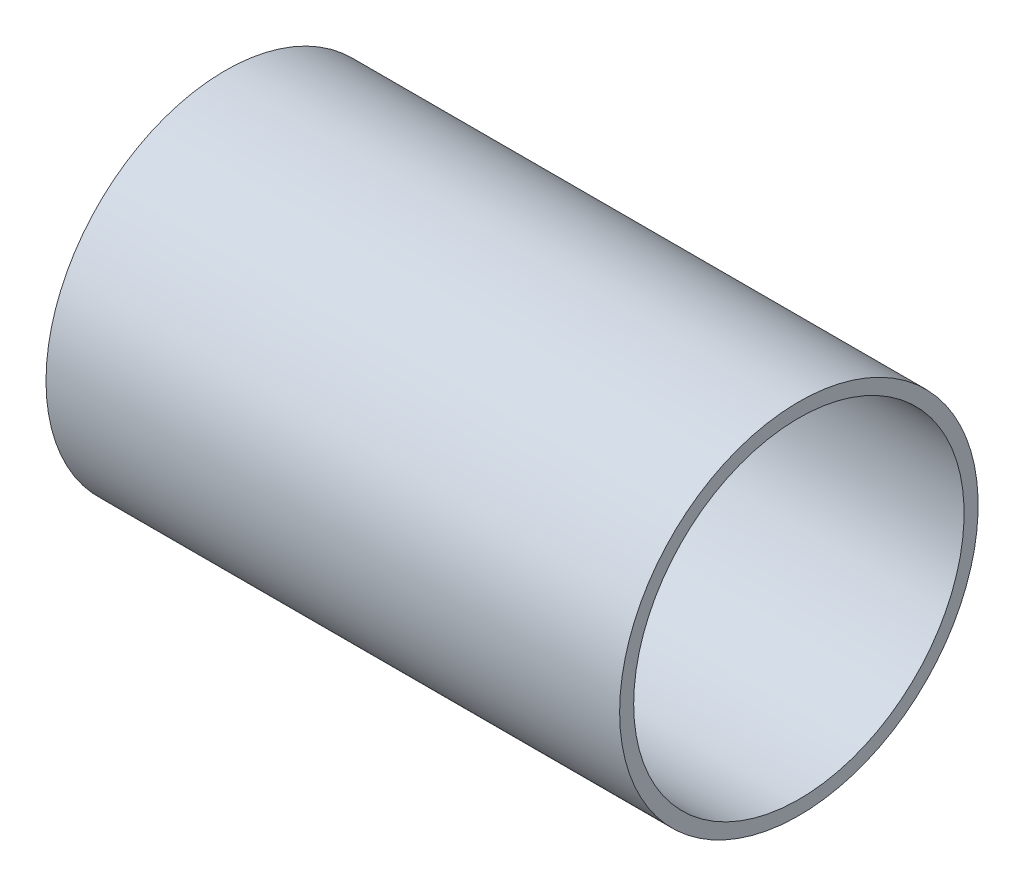
ISO-10303-21;
HEADER;
FILE_DESCRIPTION(('STEP AP214'),'2;1');
FILE_NAME('part.step','',(''),(''),'','','');
FILE_SCHEMA(('AUTOMOTIVE_DESIGN { 1 0 10303 214 1 1 1 1 }'));
ENDSEC;
DATA;
#1=APPLICATION_CONTEXT('core data for automotive mechanical design processes');
#2=APPLICATION_PROTOCOL_DEFINITION('international standard','automotive_design',2000,#1);
#3=PRODUCT_CONTEXT('',#1,'mechanical');
#4=PRODUCT('Part','Part','',(#3));
#5=PRODUCT_RELATED_PRODUCT_CATEGORY('part','',(#4));
#6=PRODUCT_DEFINITION_FORMATION('','',#4);
#7=PRODUCT_DEFINITION_CONTEXT('part definition',#1,'design');
#8=PRODUCT_DEFINITION('design','',#6,#7);
#9=PRODUCT_DEFINITION_SHAPE('','',#8);
#10=(LENGTH_UNIT() NAMED_UNIT(*) SI_UNIT(.MILLI.,.METRE.));
#11=(NAMED_UNIT(*) PLANE_ANGLE_UNIT() SI_UNIT($,.RADIAN.));
#12=(NAMED_UNIT(*) SI_UNIT($,.STERADIAN.) SOLID_ANGLE_UNIT());
#13=UNCERTAINTY_MEASURE_WITH_UNIT(LENGTH_MEASURE(1.E-05),#10,'distance_accuracy_value','');
#14=(GEOMETRIC_REPRESENTATION_CONTEXT(3) GLOBAL_UNCERTAINTY_ASSIGNED_CONTEXT((#13)) GLOBAL_UNIT_ASSIGNED_CONTEXT((#10,
#11,#12)) REPRESENTATION_CONTEXT('',''));
#15=CARTESIAN_POINT('',(0.,0.,0.));
#16=DIRECTION('',(0.,0.,1.));
#17=DIRECTION('',(1.,0.,0.));
#18=AXIS2_PLACEMENT_3D('',#15,#16,#17);
#19=CARTESIAN_POINT('',(-72.8939918967907,0.,0.));
#20=DIRECTION('',(-1.,0.,0.));
#21=DIRECTION('',(0.,0.,1.));
#22=AXIS2_PLACEMENT_3D('',#19,#20,#21);
#23=CYLINDRICAL_SURFACE('',#22,15.875);
#24=CARTESIAN_POINT('',(-25.4,0.,0.));
#25=DIRECTION('',(-1.,0.,0.));
#26=DIRECTION('',(0.,0.,1.));
#27=AXIS2_PLACEMENT_3D('',#24,#25,#26);
#28=CIRCLE('',#27,15.875);
#29=CARTESIAN_POINT('',(-25.4,0.,15.875));
#30=VERTEX_POINT('',#29);
#31=EDGE_CURVE('E46',#30,#30,#28,.T.);
#32=ORIENTED_EDGE('',*,*,#31,.F.);
#33=EDGE_LOOP('',(#32));
#34=FACE_BOUND('',#33,.T.);
#35=CARTESIAN_POINT('',(25.4,0.,0.));
#36=DIRECTION('',(-1.,0.,0.));
#37=DIRECTION('',(0.,0.,1.));
#38=AXIS2_PLACEMENT_3D('',#35,#36,#37);
#39=CIRCLE('',#38,15.875);
#40=CARTESIAN_POINT('',(25.4,0.,15.875));
#41=VERTEX_POINT('',#40);
#42=EDGE_CURVE('E10',#41,#41,#39,.T.);
#43=ORIENTED_EDGE('',*,*,#42,.T.);
#44=EDGE_LOOP('',(#43));
#45=FACE_BOUND('',#44,.T.);
#46=ADVANCED_FACE('F32',(#34,#45),#23,.T.);
#47=CARTESIAN_POINT('',(25.4,0.,-15.875));
#48=DIRECTION('',(-1.,0.,0.));
#49=DIRECTION('',(0.,0.,1.));
#50=AXIS2_PLACEMENT_3D('',#47,#48,#49);
#51=PLANE('',#50);
#52=ORIENTED_EDGE('',*,*,#42,.F.);
#53=EDGE_LOOP('',(#52));
#54=FACE_BOUND('',#53,.T.);
#55=CARTESIAN_POINT('',(25.4,0.,0.));
#56=DIRECTION('',(-1.,0.,0.));
#57=DIRECTION('',(0.,0.,1.));
#58=AXIS2_PLACEMENT_3D('',#55,#56,#57);
#59=CIRCLE('',#58,14.6304);
#60=CARTESIAN_POINT('',(25.4,0.,14.6304));
#61=VERTEX_POINT('',#60);
#62=EDGE_CURVE('E38',#61,#61,#59,.T.);
#63=ORIENTED_EDGE('',*,*,#62,.T.);
#64=EDGE_LOOP('',(#63));
#65=FACE_BOUND('',#64,.T.);
#66=ADVANCED_FACE('F55',(#54,#65),#51,.F.);
#67=CARTESIAN_POINT('',(-72.8939918967907,0.,0.));
#68=DIRECTION('',(-1.,0.,0.));
#69=DIRECTION('',(0.,0.,1.));
#70=AXIS2_PLACEMENT_3D('',#67,#68,#69);
#71=CYLINDRICAL_SURFACE('',#70,14.6304);
#72=ORIENTED_EDGE('',*,*,#62,.F.);
#73=EDGE_LOOP('',(#72));
#74=FACE_BOUND('',#73,.T.);
#75=CARTESIAN_POINT('',(-25.4,0.,0.));
#76=DIRECTION('',(-1.,0.,0.));
#77=DIRECTION('',(0.,0.,1.));
#78=AXIS2_PLACEMENT_3D('',#75,#76,#77);
#79=CIRCLE('',#78,14.6304);
#80=CARTESIAN_POINT('',(-25.4,0.,14.6304));
#81=VERTEX_POINT('',#80);
#82=EDGE_CURVE('E42',#81,#81,#79,.T.);
#83=ORIENTED_EDGE('',*,*,#82,.T.);
#84=EDGE_LOOP('',(#83));
#85=FACE_BOUND('',#84,.T.);
#86=ADVANCED_FACE('F59',(#74,#85),#71,.F.);
#87=CARTESIAN_POINT('',(-25.4,0.,-15.875));
#88=DIRECTION('',(1.,0.,0.));
#89=DIRECTION('',(0.,0.,-1.));
#90=AXIS2_PLACEMENT_3D('',#87,#88,#89);
#91=PLANE('',#90);
#92=ORIENTED_EDGE('',*,*,#82,.F.);
#93=EDGE_LOOP('',(#92));
#94=FACE_BOUND('',#93,.T.);
#95=ORIENTED_EDGE('',*,*,#31,.T.);
#96=EDGE_LOOP('',(#95));
#97=FACE_BOUND('',#96,.T.);
#98=ADVANCED_FACE('F52',(#94,#97),#91,.F.);
#99=CLOSED_SHELL('',(#46,#66,#86,#98));
#100=MANIFOLD_SOLID_BREP('B2',#99);
#101=ADVANCED_BREP_SHAPE_REPRESENTATION('',(#18,#100),#14);
#102=SHAPE_DEFINITION_REPRESENTATION(#9,#101);
ENDSEC;
END-ISO-10303-21;
